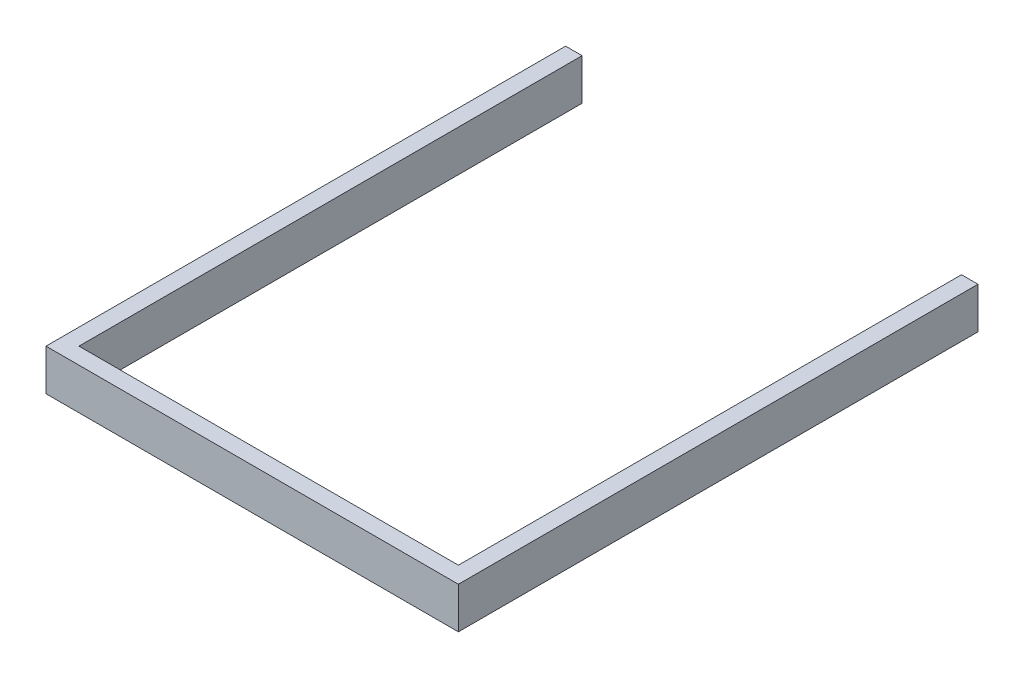
ISO-10303-21;
HEADER;
FILE_DESCRIPTION(('STEP AP214'),'2;1');
FILE_NAME('part.step','',(''),(''),'','','');
FILE_SCHEMA(('AUTOMOTIVE_DESIGN { 1 0 10303 214 1 1 1 1 }'));
ENDSEC;
DATA;
#1=APPLICATION_CONTEXT('core data for automotive mechanical design processes');
#2=APPLICATION_PROTOCOL_DEFINITION('international standard','automotive_design',2000,#1);
#3=PRODUCT_CONTEXT('',#1,'mechanical');
#4=PRODUCT('Part','Part','',(#3));
#5=PRODUCT_RELATED_PRODUCT_CATEGORY('part','',(#4));
#6=PRODUCT_DEFINITION_FORMATION('','',#4);
#7=PRODUCT_DEFINITION_CONTEXT('part definition',#1,'design');
#8=PRODUCT_DEFINITION('design','',#6,#7);
#9=PRODUCT_DEFINITION_SHAPE('','',#8);
#10=(LENGTH_UNIT() NAMED_UNIT(*) SI_UNIT(.MILLI.,.METRE.));
#11=(NAMED_UNIT(*) PLANE_ANGLE_UNIT() SI_UNIT($,.RADIAN.));
#12=(NAMED_UNIT(*) SI_UNIT($,.STERADIAN.) SOLID_ANGLE_UNIT());
#13=UNCERTAINTY_MEASURE_WITH_UNIT(LENGTH_MEASURE(1.E-05),#10,'distance_accuracy_value','');
#14=(GEOMETRIC_REPRESENTATION_CONTEXT(3) GLOBAL_UNCERTAINTY_ASSIGNED_CONTEXT((#13)) GLOBAL_UNIT_ASSIGNED_CONTEXT((#10,
#11,#12)) REPRESENTATION_CONTEXT('',''));
#15=CARTESIAN_POINT('',(0.,0.,0.));
#16=DIRECTION('',(0.,0.,1.));
#17=DIRECTION('',(1.,0.,0.));
#18=AXIS2_PLACEMENT_3D('',#15,#16,#17);
#19=CARTESIAN_POINT('',(-46.,-10.,0.));
#20=DIRECTION('',(-1.,0.,0.));
#21=DIRECTION('',(0.,0.,1.));
#22=AXIS2_PLACEMENT_3D('',#19,#20,#21);
#23=PLANE('',#22);
#24=DIRECTION('',(0.,0.,1.));
#25=VECTOR('',#24,1.);
#26=CARTESIAN_POINT('',(-46.,0.,0.));
#27=LINE('',#26,#25);
#28=CARTESIAN_POINT('',(-46.,0.,-43.));
#29=VERTEX_POINT('',#28);
#30=CARTESIAN_POINT('',(-46.,0.,79.));
#31=VERTEX_POINT('',#30);
#32=EDGE_CURVE('E127',#29,#31,#27,.T.);
#33=ORIENTED_EDGE('',*,*,#32,.T.);
#34=DIRECTION('',(0.,1.,0.));
#35=VECTOR('',#34,1.);
#36=CARTESIAN_POINT('',(-46.,-10.,79.));
#37=LINE('',#36,#35);
#38=CARTESIAN_POINT('',(-46.,-10.,79.));
#39=VERTEX_POINT('',#38);
#40=EDGE_CURVE('E11',#39,#31,#37,.T.);
#41=ORIENTED_EDGE('',*,*,#40,.F.);
#42=DIRECTION('',(0.,0.,1.));
#43=VECTOR('',#42,1.);
#44=CARTESIAN_POINT('',(-46.,-10.,0.));
#45=LINE('',#44,#43);
#46=CARTESIAN_POINT('',(-46.,-10.,-43.));
#47=VERTEX_POINT('',#46);
#48=EDGE_CURVE('E145',#47,#39,#45,.T.);
#49=ORIENTED_EDGE('',*,*,#48,.F.);
#50=DIRECTION('',(0.,1.,0.));
#51=VECTOR('',#50,1.);
#52=CARTESIAN_POINT('',(-46.,-10.,-43.));
#53=LINE('',#52,#51);
#54=EDGE_CURVE('E36',#47,#29,#53,.T.);
#55=ORIENTED_EDGE('',*,*,#54,.T.);
#56=EDGE_LOOP('',(#33,#41,#49,#55));
#57=FACE_BOUND('',#56,.T.);
#58=ADVANCED_FACE('F33',(#57),#23,.F.);
#59=CARTESIAN_POINT('',(0.,-10.,79.));
#60=DIRECTION('',(0.,0.,1.));
#61=DIRECTION('',(1.,0.,0.));
#62=AXIS2_PLACEMENT_3D('',#59,#60,#61);
#63=PLANE('',#62);
#64=DIRECTION('',(1.,0.,0.));
#65=VECTOR('',#64,1.);
#66=CARTESIAN_POINT('',(0.,0.,79.));
#67=LINE('',#66,#65);
#68=CARTESIAN_POINT('',(46.,0.,79.));
#69=VERTEX_POINT('',#68);
#70=EDGE_CURVE('E84',#31,#69,#67,.T.);
#71=ORIENTED_EDGE('',*,*,#70,.T.);
#72=DIRECTION('',(0.,1.,0.));
#73=VECTOR('',#72,1.);
#74=CARTESIAN_POINT('',(46.,-10.,79.));
#75=LINE('',#74,#73);
#76=CARTESIAN_POINT('',(46.,-10.,79.));
#77=VERTEX_POINT('',#76);
#78=EDGE_CURVE('E42',#77,#69,#75,.T.);
#79=ORIENTED_EDGE('',*,*,#78,.F.);
#80=DIRECTION('',(1.,0.,0.));
#81=VECTOR('',#80,1.);
#82=CARTESIAN_POINT('',(0.,-10.,79.));
#83=LINE('',#82,#81);
#84=EDGE_CURVE('E50',#39,#77,#83,.T.);
#85=ORIENTED_EDGE('',*,*,#84,.F.);
#86=ORIENTED_EDGE('',*,*,#40,.T.);
#87=EDGE_LOOP('',(#71,#79,#85,#86));
#88=FACE_BOUND('',#87,.T.);
#89=ADVANCED_FACE('F170',(#88),#63,.F.);
#90=CARTESIAN_POINT('',(46.,-10.,0.));
#91=DIRECTION('',(-1.,0.,0.));
#92=DIRECTION('',(0.,0.,1.));
#93=AXIS2_PLACEMENT_3D('',#90,#91,#92);
#94=PLANE('',#93);
#95=DIRECTION('',(0.,0.,1.));
#96=VECTOR('',#95,1.);
#97=CARTESIAN_POINT('',(46.,0.,0.));
#98=LINE('',#97,#96);
#99=CARTESIAN_POINT('',(46.,0.,-43.));
#100=VERTEX_POINT('',#99);
#101=EDGE_CURVE('E109',#100,#69,#98,.T.);
#102=ORIENTED_EDGE('',*,*,#101,.F.);
#103=DIRECTION('',(0.,1.,0.));
#104=VECTOR('',#103,1.);
#105=CARTESIAN_POINT('',(46.,-10.,-43.));
#106=LINE('',#105,#104);
#107=CARTESIAN_POINT('',(46.,-10.,-43.));
#108=VERTEX_POINT('',#107);
#109=EDGE_CURVE('E104',#108,#100,#106,.T.);
#110=ORIENTED_EDGE('',*,*,#109,.F.);
#111=DIRECTION('',(0.,0.,1.));
#112=VECTOR('',#111,1.);
#113=CARTESIAN_POINT('',(46.,-10.,0.));
#114=LINE('',#113,#112);
#115=EDGE_CURVE('E108',#108,#77,#114,.T.);
#116=ORIENTED_EDGE('',*,*,#115,.T.);
#117=ORIENTED_EDGE('',*,*,#78,.T.);
#118=EDGE_LOOP('',(#102,#110,#116,#117));
#119=FACE_BOUND('',#118,.T.);
#120=ADVANCED_FACE('F106',(#119),#94,.T.);
#121=CARTESIAN_POINT('',(0.,-10.,-43.));
#122=DIRECTION('',(0.,0.,1.));
#123=DIRECTION('',(1.,0.,0.));
#124=AXIS2_PLACEMENT_3D('',#121,#122,#123);
#125=PLANE('',#124);
#126=DIRECTION('',(1.,0.,0.));
#127=VECTOR('',#126,1.);
#128=CARTESIAN_POINT('',(0.,0.,-43.));
#129=LINE('',#128,#127);
#130=CARTESIAN_POINT('',(50.,0.,-43.));
#131=VERTEX_POINT('',#130);
#132=EDGE_CURVE('E142',#100,#131,#129,.T.);
#133=ORIENTED_EDGE('',*,*,#132,.T.);
#134=DIRECTION('',(0.,1.,0.));
#135=VECTOR('',#134,1.);
#136=CARTESIAN_POINT('',(50.,-10.,-43.));
#137=LINE('',#136,#135);
#138=CARTESIAN_POINT('',(50.,-10.,-43.));
#139=VERTEX_POINT('',#138);
#140=EDGE_CURVE('E112',#139,#131,#137,.T.);
#141=ORIENTED_EDGE('',*,*,#140,.F.);
#142=DIRECTION('',(1.,0.,0.));
#143=VECTOR('',#142,1.);
#144=CARTESIAN_POINT('',(0.,-10.,-43.));
#145=LINE('',#144,#143);
#146=EDGE_CURVE('E115',#108,#139,#145,.T.);
#147=ORIENTED_EDGE('',*,*,#146,.F.);
#148=ORIENTED_EDGE('',*,*,#109,.T.);
#149=EDGE_LOOP('',(#133,#141,#147,#148));
#150=FACE_BOUND('',#149,.T.);
#151=ADVANCED_FACE('F116',(#150),#125,.F.);
#152=CARTESIAN_POINT('',(50.,-10.,0.));
#153=DIRECTION('',(-1.,0.,0.));
#154=DIRECTION('',(0.,0.,1.));
#155=AXIS2_PLACEMENT_3D('',#152,#153,#154);
#156=PLANE('',#155);
#157=DIRECTION('',(0.,0.,1.));
#158=VECTOR('',#157,1.);
#159=CARTESIAN_POINT('',(50.,0.,0.));
#160=LINE('',#159,#158);
#161=CARTESIAN_POINT('',(50.,0.,83.));
#162=VERTEX_POINT('',#161);
#163=EDGE_CURVE('E139',#131,#162,#160,.T.);
#164=ORIENTED_EDGE('',*,*,#163,.T.);
#165=DIRECTION('',(0.,1.,0.));
#166=VECTOR('',#165,1.);
#167=CARTESIAN_POINT('',(50.,-10.,83.));
#168=LINE('',#167,#166);
#169=CARTESIAN_POINT('',(50.,-10.,83.));
#170=VERTEX_POINT('',#169);
#171=EDGE_CURVE('E149',#170,#162,#168,.T.);
#172=ORIENTED_EDGE('',*,*,#171,.F.);
#173=DIRECTION('',(0.,0.,1.));
#174=VECTOR('',#173,1.);
#175=CARTESIAN_POINT('',(50.,-10.,0.));
#176=LINE('',#175,#174);
#177=EDGE_CURVE('E120',#139,#170,#176,.T.);
#178=ORIENTED_EDGE('',*,*,#177,.F.);
#179=ORIENTED_EDGE('',*,*,#140,.T.);
#180=EDGE_LOOP('',(#164,#172,#178,#179));
#181=FACE_BOUND('',#180,.T.);
#182=ADVANCED_FACE('F183',(#181),#156,.F.);
#183=CARTESIAN_POINT('',(0.,-10.,83.));
#184=DIRECTION('',(0.,0.,1.));
#185=DIRECTION('',(1.,0.,0.));
#186=AXIS2_PLACEMENT_3D('',#183,#184,#185);
#187=PLANE('',#186);
#188=DIRECTION('',(1.,0.,0.));
#189=VECTOR('',#188,1.);
#190=CARTESIAN_POINT('',(0.,0.,83.));
#191=LINE('',#190,#189);
#192=CARTESIAN_POINT('',(-50.,0.,83.));
#193=VERTEX_POINT('',#192);
#194=EDGE_CURVE('E136',#193,#162,#191,.T.);
#195=ORIENTED_EDGE('',*,*,#194,.F.);
#196=DIRECTION('',(0.,1.,0.));
#197=VECTOR('',#196,1.);
#198=CARTESIAN_POINT('',(-50.,-10.,83.));
#199=LINE('',#198,#197);
#200=CARTESIAN_POINT('',(-50.,-10.,83.));
#201=VERTEX_POINT('',#200);
#202=EDGE_CURVE('E151',#201,#193,#199,.T.);
#203=ORIENTED_EDGE('',*,*,#202,.F.);
#204=DIRECTION('',(1.,0.,0.));
#205=VECTOR('',#204,1.);
#206=CARTESIAN_POINT('',(0.,-10.,83.));
#207=LINE('',#206,#205);
#208=EDGE_CURVE('E199',#201,#170,#207,.T.);
#209=ORIENTED_EDGE('',*,*,#208,.T.);
#210=ORIENTED_EDGE('',*,*,#171,.T.);
#211=EDGE_LOOP('',(#195,#203,#209,#210));
#212=FACE_BOUND('',#211,.T.);
#213=ADVANCED_FACE('F166',(#212),#187,.T.);
#214=CARTESIAN_POINT('',(-50.,-10.,0.));
#215=DIRECTION('',(-1.,0.,0.));
#216=DIRECTION('',(0.,0.,1.));
#217=AXIS2_PLACEMENT_3D('',#214,#215,#216);
#218=PLANE('',#217);
#219=DIRECTION('',(0.,0.,1.));
#220=VECTOR('',#219,1.);
#221=CARTESIAN_POINT('',(-50.,0.,0.));
#222=LINE('',#221,#220);
#223=CARTESIAN_POINT('',(-50.,0.,-43.));
#224=VERTEX_POINT('',#223);
#225=EDGE_CURVE('E133',#224,#193,#222,.T.);
#226=ORIENTED_EDGE('',*,*,#225,.F.);
#227=DIRECTION('',(0.,1.,0.));
#228=VECTOR('',#227,1.);
#229=CARTESIAN_POINT('',(-50.,-10.,-43.));
#230=LINE('',#229,#228);
#231=CARTESIAN_POINT('',(-50.,-10.,-43.));
#232=VERTEX_POINT('',#231);
#233=EDGE_CURVE('E152',#232,#224,#230,.T.);
#234=ORIENTED_EDGE('',*,*,#233,.F.);
#235=DIRECTION('',(0.,0.,1.));
#236=VECTOR('',#235,1.);
#237=CARTESIAN_POINT('',(-50.,-10.,0.));
#238=LINE('',#237,#236);
#239=EDGE_CURVE('E198',#232,#201,#238,.T.);
#240=ORIENTED_EDGE('',*,*,#239,.T.);
#241=ORIENTED_EDGE('',*,*,#202,.T.);
#242=EDGE_LOOP('',(#226,#234,#240,#241));
#243=FACE_BOUND('',#242,.T.);
#244=ADVANCED_FACE('F160',(#243),#218,.T.);
#245=CARTESIAN_POINT('',(0.,-10.,-43.));
#246=DIRECTION('',(0.,0.,-1.));
#247=DIRECTION('',(-1.,0.,0.));
#248=AXIS2_PLACEMENT_3D('',#245,#246,#247);
#249=PLANE('',#248);
#250=DIRECTION('',(-1.,0.,0.));
#251=VECTOR('',#250,1.);
#252=CARTESIAN_POINT('',(0.,0.,-43.));
#253=LINE('',#252,#251);
#254=EDGE_CURVE('E130',#29,#224,#253,.T.);
#255=ORIENTED_EDGE('',*,*,#254,.F.);
#256=ORIENTED_EDGE('',*,*,#54,.F.);
#257=DIRECTION('',(-1.,0.,0.));
#258=VECTOR('',#257,1.);
#259=CARTESIAN_POINT('',(0.,-10.,-43.));
#260=LINE('',#259,#258);
#261=EDGE_CURVE('E200',#47,#232,#260,.T.);
#262=ORIENTED_EDGE('',*,*,#261,.T.);
#263=ORIENTED_EDGE('',*,*,#233,.T.);
#264=EDGE_LOOP('',(#255,#256,#262,#263));
#265=FACE_BOUND('',#264,.T.);
#266=ADVANCED_FACE('F158',(#265),#249,.T.);
#267=CARTESIAN_POINT('',(0.,-10.,0.));
#268=DIRECTION('',(0.,1.,0.));
#269=DIRECTION('',(0.,0.,1.));
#270=AXIS2_PLACEMENT_3D('',#267,#268,#269);
#271=PLANE('',#270);
#272=ORIENTED_EDGE('',*,*,#48,.T.);
#273=ORIENTED_EDGE('',*,*,#84,.T.);
#274=ORIENTED_EDGE('',*,*,#115,.F.);
#275=ORIENTED_EDGE('',*,*,#146,.T.);
#276=ORIENTED_EDGE('',*,*,#177,.T.);
#277=ORIENTED_EDGE('',*,*,#208,.F.);
#278=ORIENTED_EDGE('',*,*,#239,.F.);
#279=ORIENTED_EDGE('',*,*,#261,.F.);
#280=EDGE_LOOP('',(#272,#273,#274,#275,#276,#277,#278,#279));
#281=FACE_BOUND('',#280,.T.);
#282=ADVANCED_FACE('F122',(#281),#271,.F.);
#283=CARTESIAN_POINT('',(0.,0.,0.));
#284=DIRECTION('',(0.,1.,0.));
#285=DIRECTION('',(0.,0.,1.));
#286=AXIS2_PLACEMENT_3D('',#283,#284,#285);
#287=PLANE('',#286);
#288=ORIENTED_EDGE('',*,*,#32,.F.);
#289=ORIENTED_EDGE('',*,*,#254,.T.);
#290=ORIENTED_EDGE('',*,*,#225,.T.);
#291=ORIENTED_EDGE('',*,*,#194,.T.);
#292=ORIENTED_EDGE('',*,*,#163,.F.);
#293=ORIENTED_EDGE('',*,*,#132,.F.);
#294=ORIENTED_EDGE('',*,*,#101,.T.);
#295=ORIENTED_EDGE('',*,*,#70,.F.);
#296=EDGE_LOOP('',(#288,#289,#290,#291,#292,#293,#294,#295));
#297=FACE_BOUND('',#296,.T.);
#298=ADVANCED_FACE('F157',(#297),#287,.T.);
#299=CLOSED_SHELL('',(#58,#89,#120,#151,#182,#213,#244,#266,#282,#298));
#300=MANIFOLD_SOLID_BREP('B2',#299);
#301=ADVANCED_BREP_SHAPE_REPRESENTATION('',(#18,#300),#14);
#302=SHAPE_DEFINITION_REPRESENTATION(#9,#301);
ENDSEC;
END-ISO-10303-21;
